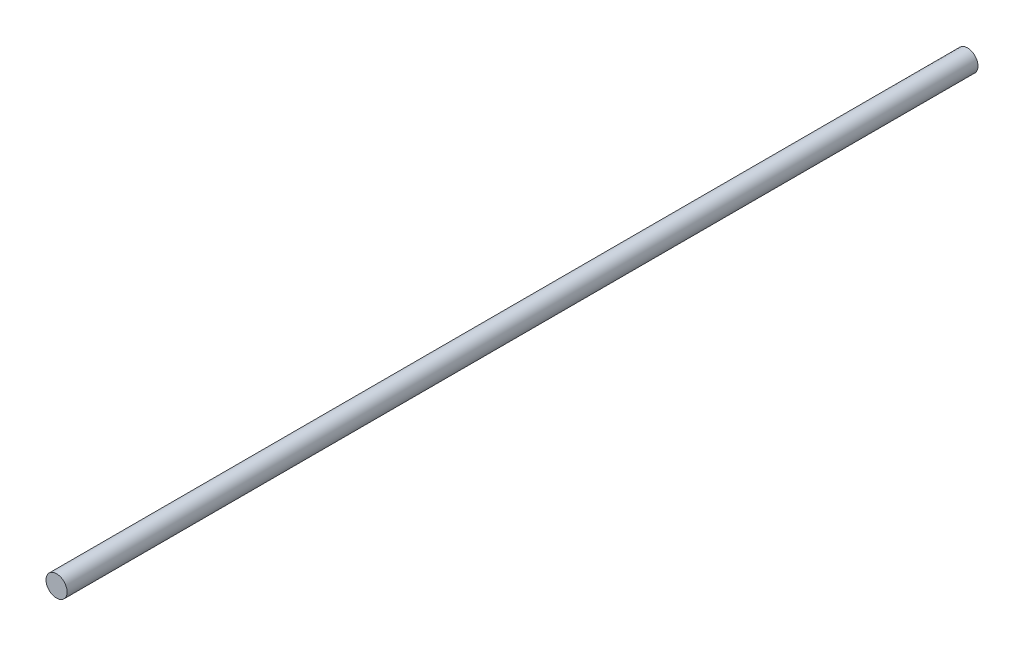
ISO-10303-21;
HEADER;
FILE_DESCRIPTION(('STEP AP214'),'2;1');
FILE_NAME('part.step','',(''),(''),'','','');
FILE_SCHEMA(('AUTOMOTIVE_DESIGN { 1 0 10303 214 1 1 1 1 }'));
ENDSEC;
DATA;
#1=APPLICATION_CONTEXT('core data for automotive mechanical design processes');
#2=APPLICATION_PROTOCOL_DEFINITION('international standard','automotive_design',2000,#1);
#3=PRODUCT_CONTEXT('',#1,'mechanical');
#4=PRODUCT('Part','Part','',(#3));
#5=PRODUCT_RELATED_PRODUCT_CATEGORY('part','',(#4));
#6=PRODUCT_DEFINITION_FORMATION('','',#4);
#7=PRODUCT_DEFINITION_CONTEXT('part definition',#1,'design');
#8=PRODUCT_DEFINITION('design','',#6,#7);
#9=PRODUCT_DEFINITION_SHAPE('','',#8);
#10=(LENGTH_UNIT() NAMED_UNIT(*) SI_UNIT(.MILLI.,.METRE.));
#11=(NAMED_UNIT(*) PLANE_ANGLE_UNIT() SI_UNIT($,.RADIAN.));
#12=(NAMED_UNIT(*) SI_UNIT($,.STERADIAN.) SOLID_ANGLE_UNIT());
#13=UNCERTAINTY_MEASURE_WITH_UNIT(LENGTH_MEASURE(1.E-05),#10,'distance_accuracy_value','');
#14=(GEOMETRIC_REPRESENTATION_CONTEXT(3) GLOBAL_UNCERTAINTY_ASSIGNED_CONTEXT((#13)) GLOBAL_UNIT_ASSIGNED_CONTEXT((#10,
#11,#12)) REPRESENTATION_CONTEXT('',''));
#15=CARTESIAN_POINT('',(0.,0.,0.));
#16=DIRECTION('',(0.,0.,1.));
#17=DIRECTION('',(1.,0.,0.));
#18=AXIS2_PLACEMENT_3D('',#15,#16,#17);
#19=CARTESIAN_POINT('',(0.,0.,345.));
#20=DIRECTION('',(0.,0.,-1.));
#21=DIRECTION('',(-1.,0.,0.));
#22=AXIS2_PLACEMENT_3D('',#19,#20,#21);
#23=CYLINDRICAL_SURFACE('',#22,4.);
#24=CARTESIAN_POINT('',(0.,0.,345.));
#25=DIRECTION('',(0.,0.,1.));
#26=DIRECTION('',(1.,0.,0.));
#27=AXIS2_PLACEMENT_3D('',#24,#25,#26);
#28=CIRCLE('',#27,4.);
#29=CARTESIAN_POINT('',(4.,0.,345.));
#30=VERTEX_POINT('',#29);
#31=EDGE_CURVE('E10',#30,#30,#28,.T.);
#32=ORIENTED_EDGE('',*,*,#31,.F.);
#33=EDGE_LOOP('',(#32));
#34=FACE_BOUND('',#33,.T.);
#35=CARTESIAN_POINT('',(0.,0.,0.));
#36=DIRECTION('',(0.,0.,1.));
#37=DIRECTION('',(1.,0.,0.));
#38=AXIS2_PLACEMENT_3D('',#35,#36,#37);
#39=CIRCLE('',#38,4.);
#40=CARTESIAN_POINT('',(4.,0.,0.));
#41=VERTEX_POINT('',#40);
#42=EDGE_CURVE('E33',#41,#41,#39,.T.);
#43=ORIENTED_EDGE('',*,*,#42,.T.);
#44=EDGE_LOOP('',(#43));
#45=FACE_BOUND('',#44,.T.);
#46=ADVANCED_FACE('F30',(#34,#45),#23,.T.);
#47=CARTESIAN_POINT('',(0.,0.,345.));
#48=DIRECTION('',(0.,0.,1.));
#49=DIRECTION('',(1.,0.,0.));
#50=AXIS2_PLACEMENT_3D('',#47,#48,#49);
#51=PLANE('',#50);
#52=ORIENTED_EDGE('',*,*,#31,.T.);
#53=EDGE_LOOP('',(#52));
#54=FACE_BOUND('',#53,.T.);
#55=ADVANCED_FACE('F45',(#54),#51,.T.);
#56=CARTESIAN_POINT('',(0.,0.,0.));
#57=DIRECTION('',(0.,0.,1.));
#58=DIRECTION('',(1.,0.,0.));
#59=AXIS2_PLACEMENT_3D('',#56,#57,#58);
#60=PLANE('',#59);
#61=ORIENTED_EDGE('',*,*,#42,.F.);
#62=EDGE_LOOP('',(#61));
#63=FACE_BOUND('',#62,.T.);
#64=ADVANCED_FACE('F43',(#63),#60,.F.);
#65=CLOSED_SHELL('',(#46,#55,#64));
#66=MANIFOLD_SOLID_BREP('B2',#65);
#67=ADVANCED_BREP_SHAPE_REPRESENTATION('',(#18,#66),#14);
#68=SHAPE_DEFINITION_REPRESENTATION(#9,#67);
ENDSEC;
END-ISO-10303-21;
